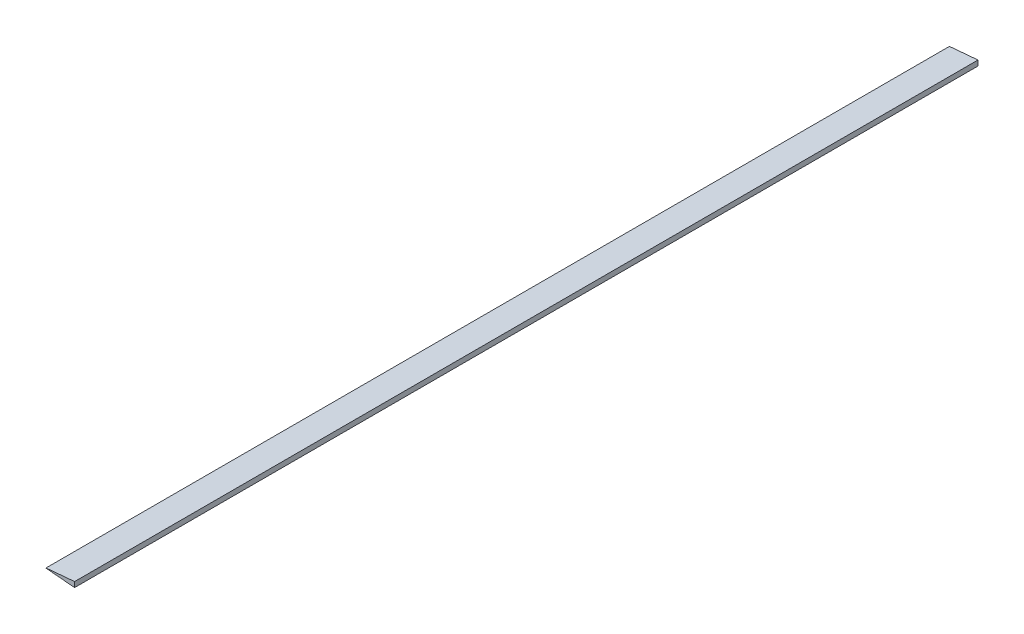
ISO-10303-21;
HEADER;
FILE_DESCRIPTION(('STEP AP214'),'2;1');
FILE_NAME('part.step','',(''),(''),'','','');
FILE_SCHEMA(('AUTOMOTIVE_DESIGN { 1 0 10303 214 1 1 1 1 }'));
ENDSEC;
DATA;
#1=APPLICATION_CONTEXT('core data for automotive mechanical design processes');
#2=APPLICATION_PROTOCOL_DEFINITION('international standard','automotive_design',2000,#1);
#3=PRODUCT_CONTEXT('',#1,'mechanical');
#4=PRODUCT('Part','Part','',(#3));
#5=PRODUCT_RELATED_PRODUCT_CATEGORY('part','',(#4));
#6=PRODUCT_DEFINITION_FORMATION('','',#4);
#7=PRODUCT_DEFINITION_CONTEXT('part definition',#1,'design');
#8=PRODUCT_DEFINITION('design','',#6,#7);
#9=PRODUCT_DEFINITION_SHAPE('','',#8);
#10=(LENGTH_UNIT() NAMED_UNIT(*) SI_UNIT(.MILLI.,.METRE.));
#11=(NAMED_UNIT(*) PLANE_ANGLE_UNIT() SI_UNIT($,.RADIAN.));
#12=(NAMED_UNIT(*) SI_UNIT($,.STERADIAN.) SOLID_ANGLE_UNIT());
#13=UNCERTAINTY_MEASURE_WITH_UNIT(LENGTH_MEASURE(1.E-05),#10,'distance_accuracy_value','');
#14=(GEOMETRIC_REPRESENTATION_CONTEXT(3) GLOBAL_UNCERTAINTY_ASSIGNED_CONTEXT((#13)) GLOBAL_UNIT_ASSIGNED_CONTEXT((#10,
#11,#12)) REPRESENTATION_CONTEXT('',''));
#15=CARTESIAN_POINT('',(0.,0.,0.));
#16=DIRECTION('',(0.,0.,1.));
#17=DIRECTION('',(1.,0.,0.));
#18=AXIS2_PLACEMENT_3D('',#15,#16,#17);
#19=CARTESIAN_POINT('',(-62.4953,2.45259473250122,422.9));
#20=CARTESIAN_POINT('',(-62.59554123879,2.445521659257,422.9));
#21=CARTESIAN_POINT('',(-64.084046323204,2.34049197672784,422.9));
#22=CARTESIAN_POINT('',(-66.8783511207592,2.12409293521296,422.9));
#23=CARTESIAN_POINT('',(-70.7827908181073,1.81237465408149,422.9));
#24=CARTESIAN_POINT('',(-74.4006501417902,1.50629893959806,422.9));
#25=CARTESIAN_POINT('',(-77.6924746620903,1.21533963728139,422.9));
#26=CARTESIAN_POINT('',(-80.6221507650324,0.945556494347153,422.9));
#27=CARTESIAN_POINT('',(-83.1575910588998,0.703590248057787,422.9));
#28=CARTESIAN_POINT('',(-85.271018327906,0.495574613874005,422.9));
#29=CARTESIAN_POINT('',(-86.9392865965681,0.327147857598112,422.9));
#30=CARTESIAN_POINT('',(-88.1441249044109,0.203082754094441,422.9));
#31=CARTESIAN_POINT('',(-88.8723472888321,0.127116630191314,422.9));
#32=CARTESIAN_POINT('',(-89.1974872850511,0.0929374003217815,422.9));
#33=CARTESIAN_POINT('',(-89.279,0.0843686549999985,422.9));
#34=B_SPLINE_CURVE_WITH_KNOTS('',3,(#19,#20,#21,#22,#23,#24,#25,#26,#27,#28,#29,#30,#31,#32,
#33),.UNSPECIFIED.,.F.,.F.,(4,1,1,1,1,1,1,1,1,1,1,1,4),(0.,0.0112115722778317,0.166483201337751,
0.312686160175411,0.448210552609216,0.571562715657406,0.681381362004342,0.776452466822885,
0.855722863352053,0.918312437422216,0.963524724344559,0.990855635167136,1.),.UNSPECIFIED.);
#35=DIRECTION('',(0.,0.,-1.));
#36=VECTOR('',#35,1.);
#37=SURFACE_OF_LINEAR_EXTRUSION('',#34,#36);
#38=CARTESIAN_POINT('',(-62.4953,2.45259473250122,-422.9));
#39=CARTESIAN_POINT('',(-62.59554123879,2.445521659257,-422.9));
#40=CARTESIAN_POINT('',(-64.084046323204,2.34049197672784,-422.9));
#41=CARTESIAN_POINT('',(-66.8783511207592,2.12409293521296,-422.9));
#42=CARTESIAN_POINT('',(-70.7827908181073,1.81237465408149,-422.9));
#43=CARTESIAN_POINT('',(-74.4006501417902,1.50629893959806,-422.9));
#44=CARTESIAN_POINT('',(-77.6924746620903,1.21533963728139,-422.9));
#45=CARTESIAN_POINT('',(-80.6221507650324,0.945556494347153,-422.9));
#46=CARTESIAN_POINT('',(-83.1575910588998,0.703590248057787,-422.9));
#47=CARTESIAN_POINT('',(-85.271018327906,0.495574613874005,-422.9));
#48=CARTESIAN_POINT('',(-86.9392865965681,0.327147857598112,-422.9));
#49=CARTESIAN_POINT('',(-88.1441249044109,0.203082754094441,-422.9));
#50=CARTESIAN_POINT('',(-88.8723472888321,0.127116630191314,-422.9));
#51=CARTESIAN_POINT('',(-89.1974872850511,0.0929374003217815,-422.9));
#52=CARTESIAN_POINT('',(-89.279,0.0843686549999985,-422.9));
#53=B_SPLINE_CURVE_WITH_KNOTS('',3,(#38,#39,#40,#41,#42,#43,#44,#45,#46,#47,#48,#49,#50,#51,
#52),.UNSPECIFIED.,.F.,.F.,(4,1,1,1,1,1,1,1,1,1,1,1,4),(0.,0.0112115722778317,0.166483201337751,
0.312686160175411,0.448210552609216,0.571562715657406,0.681381362004342,0.776452466822885,
0.855722863352053,0.918312437422216,0.963524724344559,0.990855635167136,1.),.UNSPECIFIED.);
#54=CARTESIAN_POINT('',(-62.4953,2.45259473250122,-422.9));
#55=VERTEX_POINT('',#54);
#56=CARTESIAN_POINT('',(-89.279,0.0843686549999985,-422.9));
#57=VERTEX_POINT('',#56);
#58=EDGE_CURVE('E122',#55,#57,#53,.T.);
#59=ORIENTED_EDGE('',*,*,#58,.T.);
#60=DIRECTION('',(0.,0.,-1.));
#61=VECTOR('',#60,1.);
#62=CARTESIAN_POINT('',(-89.279,0.0843686549999985,422.9));
#63=LINE('',#62,#61);
#64=CARTESIAN_POINT('',(-89.279,0.0843686549999985,422.9));
#65=VERTEX_POINT('',#64);
#66=EDGE_CURVE('E11',#65,#57,#63,.T.);
#67=ORIENTED_EDGE('',*,*,#66,.F.);
#68=CARTESIAN_POINT('',(-62.4953,2.45259473250122,422.9));
#69=VERTEX_POINT('',#68);
#70=EDGE_CURVE('E91',#69,#65,#34,.T.);
#71=ORIENTED_EDGE('',*,*,#70,.F.);
#72=DIRECTION('',(0.,0.,-1.));
#73=VECTOR('',#72,1.);
#74=CARTESIAN_POINT('',(-62.4953,2.45259473250122,422.9));
#75=LINE('',#74,#73);
#76=EDGE_CURVE('E99',#69,#55,#75,.T.);
#77=ORIENTED_EDGE('',*,*,#76,.T.);
#78=EDGE_LOOP('',(#59,#67,#71,#77));
#79=FACE_BOUND('',#78,.T.);
#80=ADVANCED_FACE('F39',(#79),#37,.F.);
#81=CARTESIAN_POINT('',(-89.279,0.0843686549999985,422.9));
#82=DIRECTION('',(1.,0.,0.));
#83=DIRECTION('',(0.,0.,-1.));
#84=AXIS2_PLACEMENT_3D('',#81,#82,#83);
#85=PLANE('',#84);
#86=DIRECTION('',(0.,-1.,0.));
#87=VECTOR('',#86,1.);
#88=CARTESIAN_POINT('',(-89.279,0.0843686549999985,-422.9));
#89=LINE('',#88,#87);
#90=CARTESIAN_POINT('',(-89.279,-0.0843686549999985,-422.9));
#91=VERTEX_POINT('',#90);
#92=EDGE_CURVE('E95',#57,#91,#89,.T.);
#93=ORIENTED_EDGE('',*,*,#92,.T.);
#94=DIRECTION('',(0.,0.,-1.));
#95=VECTOR('',#94,1.);
#96=CARTESIAN_POINT('',(-89.279,-0.0843686549999985,422.9));
#97=LINE('',#96,#95);
#98=CARTESIAN_POINT('',(-89.279,-0.0843686549999985,422.9));
#99=VERTEX_POINT('',#98);
#100=EDGE_CURVE('E48',#99,#91,#97,.T.);
#101=ORIENTED_EDGE('',*,*,#100,.F.);
#102=DIRECTION('',(0.,-1.,0.));
#103=VECTOR('',#102,1.);
#104=CARTESIAN_POINT('',(-89.279,0.0843686549999985,422.9));
#105=LINE('',#104,#103);
#106=EDGE_CURVE('E86',#65,#99,#105,.T.);
#107=ORIENTED_EDGE('',*,*,#106,.F.);
#108=ORIENTED_EDGE('',*,*,#66,.T.);
#109=EDGE_LOOP('',(#93,#101,#107,#108));
#110=FACE_BOUND('',#109,.T.);
#111=ADVANCED_FACE('F94',(#110),#85,.F.);
#112=CARTESIAN_POINT('',(-89.279,-0.0843686549999985,422.9));
#113=CARTESIAN_POINT('',(-89.1974872850511,-0.0929374003217815,422.9));
#114=CARTESIAN_POINT('',(-88.8723472888321,-0.127116630191314,422.9));
#115=CARTESIAN_POINT('',(-88.1441249044109,-0.203082754094441,422.9));
#116=CARTESIAN_POINT('',(-86.9392865965681,-0.327147857598112,422.9));
#117=CARTESIAN_POINT('',(-85.271018327906,-0.495574613874005,422.9));
#118=CARTESIAN_POINT('',(-83.1575910588998,-0.703590248057787,422.9));
#119=CARTESIAN_POINT('',(-80.6221507650324,-0.945556494347153,422.9));
#120=CARTESIAN_POINT('',(-77.6924746620903,-1.21533963728139,422.9));
#121=CARTESIAN_POINT('',(-74.4006501417902,-1.50629893959806,422.9));
#122=CARTESIAN_POINT('',(-70.7827908181073,-1.81237465408149,422.9));
#123=CARTESIAN_POINT('',(-66.8783511207592,-2.12409293521296,422.9));
#124=CARTESIAN_POINT('',(-64.084046323204,-2.34049197672784,422.9));
#125=CARTESIAN_POINT('',(-62.59554123879,-2.445521659257,422.9));
#126=CARTESIAN_POINT('',(-62.4953,-2.45259473250122,422.9));
#127=B_SPLINE_CURVE_WITH_KNOTS('',3,(#112,#113,#114,#115,#116,#117,#118,#119,#120,#121,#122,
#123,#124,#125,#126),.UNSPECIFIED.,.F.,.F.,(4,1,1,1,1,1,1,1,1,1,1,1,4),(0.,0.00914436483286352,
0.0364752756554413,0.0816875625777836,0.144277136647947,0.223547533177115,0.318618637995658,
0.428437284342594,0.551789447390784,0.687313839824589,0.833516798662249,0.988788427722168,1.),.UNSPECIFIED.);
#128=DIRECTION('',(0.,0.,-1.));
#129=VECTOR('',#128,1.);
#130=SURFACE_OF_LINEAR_EXTRUSION('',#127,#129);
#131=CARTESIAN_POINT('',(-89.279,-0.0843686549999985,-422.9));
#132=CARTESIAN_POINT('',(-89.1974872850511,-0.0929374003217815,-422.9));
#133=CARTESIAN_POINT('',(-88.8723472888321,-0.127116630191314,-422.9));
#134=CARTESIAN_POINT('',(-88.1441249044109,-0.203082754094441,-422.9));
#135=CARTESIAN_POINT('',(-86.9392865965681,-0.327147857598112,-422.9));
#136=CARTESIAN_POINT('',(-85.271018327906,-0.495574613874005,-422.9));
#137=CARTESIAN_POINT('',(-83.1575910588998,-0.703590248057787,-422.9));
#138=CARTESIAN_POINT('',(-80.6221507650324,-0.945556494347153,-422.9));
#139=CARTESIAN_POINT('',(-77.6924746620903,-1.21533963728139,-422.9));
#140=CARTESIAN_POINT('',(-74.4006501417902,-1.50629893959806,-422.9));
#141=CARTESIAN_POINT('',(-70.7827908181073,-1.81237465408149,-422.9));
#142=CARTESIAN_POINT('',(-66.8783511207592,-2.12409293521296,-422.9));
#143=CARTESIAN_POINT('',(-64.084046323204,-2.34049197672784,-422.9));
#144=CARTESIAN_POINT('',(-62.59554123879,-2.445521659257,-422.9));
#145=CARTESIAN_POINT('',(-62.4953,-2.45259473250122,-422.9));
#146=B_SPLINE_CURVE_WITH_KNOTS('',3,(#131,#132,#133,#134,#135,#136,#137,#138,#139,#140,#141,
#142,#143,#144,#145),.UNSPECIFIED.,.F.,.F.,(4,1,1,1,1,1,1,1,1,1,1,1,4),(0.,0.00914436483286352,
0.0364752756554413,0.0816875625777836,0.144277136647947,0.223547533177115,0.318618637995658,
0.428437284342594,0.551789447390784,0.687313839824589,0.833516798662249,0.988788427722168,1.),.UNSPECIFIED.);
#147=CARTESIAN_POINT('',(-62.4953,-2.45259473250122,-422.9));
#148=VERTEX_POINT('',#147);
#149=EDGE_CURVE('E73',#91,#148,#146,.T.);
#150=ORIENTED_EDGE('',*,*,#149,.T.);
#151=DIRECTION('',(0.,0.,-1.));
#152=VECTOR('',#151,1.);
#153=CARTESIAN_POINT('',(-62.4953,-2.45259473250122,422.9));
#154=LINE('',#153,#152);
#155=CARTESIAN_POINT('',(-62.4953,-2.45259473250122,422.9));
#156=VERTEX_POINT('',#155);
#157=EDGE_CURVE('E96',#156,#148,#154,.T.);
#158=ORIENTED_EDGE('',*,*,#157,.F.);
#159=EDGE_CURVE('E89',#99,#156,#127,.T.);
#160=ORIENTED_EDGE('',*,*,#159,.F.);
#161=ORIENTED_EDGE('',*,*,#100,.T.);
#162=EDGE_LOOP('',(#150,#158,#160,#161));
#163=FACE_BOUND('',#162,.T.);
#164=ADVANCED_FACE('F97',(#163),#130,.F.);
#165=CARTESIAN_POINT('',(-62.4953,2.45259473250122,422.9));
#166=DIRECTION('',(-1.,0.,0.));
#167=DIRECTION('',(0.,0.,1.));
#168=AXIS2_PLACEMENT_3D('',#165,#166,#167);
#169=PLANE('',#168);
#170=DIRECTION('',(0.,1.,0.));
#171=VECTOR('',#170,1.);
#172=CARTESIAN_POINT('',(-62.4953,2.45259473250122,-422.9));
#173=LINE('',#172,#171);
#174=EDGE_CURVE('E79',#148,#55,#173,.T.);
#175=ORIENTED_EDGE('',*,*,#174,.T.);
#176=ORIENTED_EDGE('',*,*,#76,.F.);
#177=DIRECTION('',(0.,1.,0.));
#178=VECTOR('',#177,1.);
#179=CARTESIAN_POINT('',(-62.4953,2.45259473250122,422.9));
#180=LINE('',#179,#178);
#181=EDGE_CURVE('E56',#156,#69,#180,.T.);
#182=ORIENTED_EDGE('',*,*,#181,.F.);
#183=ORIENTED_EDGE('',*,*,#157,.T.);
#184=EDGE_LOOP('',(#175,#176,#182,#183));
#185=FACE_BOUND('',#184,.T.);
#186=ADVANCED_FACE('F111',(#185),#169,.F.);
#187=CARTESIAN_POINT('',(-75.8964562435542,1.37353935507831,422.9));
#188=DIRECTION('',(0.,0.,-1.));
#189=DIRECTION('',(-1.,0.,0.));
#190=AXIS2_PLACEMENT_3D('',#187,#188,#189);
#191=PLANE('',#190);
#192=ORIENTED_EDGE('',*,*,#70,.T.);
#193=ORIENTED_EDGE('',*,*,#106,.T.);
#194=ORIENTED_EDGE('',*,*,#159,.T.);
#195=ORIENTED_EDGE('',*,*,#181,.T.);
#196=EDGE_LOOP('',(#192,#193,#194,#195));
#197=FACE_BOUND('',#196,.T.);
#198=ADVANCED_FACE('F87',(#197),#191,.F.);
#199=CARTESIAN_POINT('',(-75.8964562435542,1.37353935507831,-422.9));
#200=DIRECTION('',(0.,0.,-1.));
#201=DIRECTION('',(-1.,0.,0.));
#202=AXIS2_PLACEMENT_3D('',#199,#200,#201);
#203=PLANE('',#202);
#204=ORIENTED_EDGE('',*,*,#58,.F.);
#205=ORIENTED_EDGE('',*,*,#174,.F.);
#206=ORIENTED_EDGE('',*,*,#149,.F.);
#207=ORIENTED_EDGE('',*,*,#92,.F.);
#208=EDGE_LOOP('',(#204,#205,#206,#207));
#209=FACE_BOUND('',#208,.T.);
#210=ADVANCED_FACE('F139',(#209),#203,.T.);
#211=CLOSED_SHELL('',(#80,#111,#164,#186,#198,#210));
#212=MANIFOLD_SOLID_BREP('B2',#211);
#213=ADVANCED_BREP_SHAPE_REPRESENTATION('',(#18,#212),#14);
#214=SHAPE_DEFINITION_REPRESENTATION(#9,#213);
ENDSEC;
END-ISO-10303-21;
